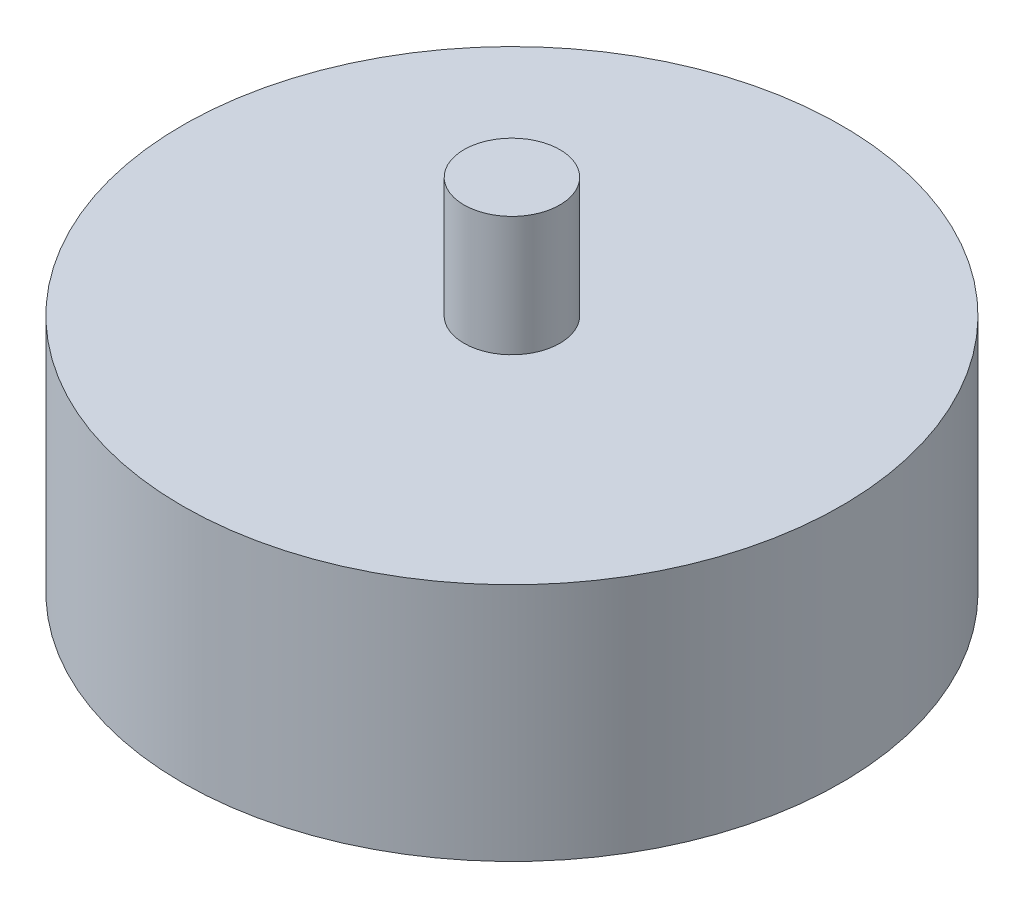
ISO-10303-21;
HEADER;
FILE_DESCRIPTION(('STEP AP214'),'2;1');
FILE_NAME('part.step','',(''),(''),'','','');
FILE_SCHEMA(('AUTOMOTIVE_DESIGN { 1 0 10303 214 1 1 1 1 }'));
ENDSEC;
DATA;
#1=APPLICATION_CONTEXT('core data for automotive mechanical design processes');
#2=APPLICATION_PROTOCOL_DEFINITION('international standard','automotive_design',2000,#1);
#3=PRODUCT_CONTEXT('',#1,'mechanical');
#4=PRODUCT('Part','Part','',(#3));
#5=PRODUCT_RELATED_PRODUCT_CATEGORY('part','',(#4));
#6=PRODUCT_DEFINITION_FORMATION('','',#4);
#7=PRODUCT_DEFINITION_CONTEXT('part definition',#1,'design');
#8=PRODUCT_DEFINITION('design','',#6,#7);
#9=PRODUCT_DEFINITION_SHAPE('','',#8);
#10=(LENGTH_UNIT() NAMED_UNIT(*) SI_UNIT(.MILLI.,.METRE.));
#11=(NAMED_UNIT(*) PLANE_ANGLE_UNIT() SI_UNIT($,.RADIAN.));
#12=(NAMED_UNIT(*) SI_UNIT($,.STERADIAN.) SOLID_ANGLE_UNIT());
#13=UNCERTAINTY_MEASURE_WITH_UNIT(LENGTH_MEASURE(1.E-05),#10,'distance_accuracy_value','');
#14=(GEOMETRIC_REPRESENTATION_CONTEXT(3) GLOBAL_UNCERTAINTY_ASSIGNED_CONTEXT((#13)) GLOBAL_UNIT_ASSIGNED_CONTEXT((#10,
#11,#12)) REPRESENTATION_CONTEXT('',''));
#15=CARTESIAN_POINT('',(0.,0.,0.));
#16=DIRECTION('',(0.,0.,1.));
#17=DIRECTION('',(1.,0.,0.));
#18=AXIS2_PLACEMENT_3D('',#15,#16,#17);
#19=CARTESIAN_POINT('',(0.,20.,0.));
#20=DIRECTION('',(0.,-1.,0.));
#21=DIRECTION('',(0.,0.,-1.));
#22=AXIS2_PLACEMENT_3D('',#19,#20,#21);
#23=CYLINDRICAL_SURFACE('',#22,27.5);
#24=CARTESIAN_POINT('',(0.,20.,0.));
#25=DIRECTION('',(0.,1.,0.));
#26=DIRECTION('',(0.,0.,1.));
#27=AXIS2_PLACEMENT_3D('',#24,#25,#26);
#28=CIRCLE('',#27,27.5);
#29=CARTESIAN_POINT('',(0.,20.,27.5));
#30=VERTEX_POINT('',#29);
#31=EDGE_CURVE('E10',#30,#30,#28,.T.);
#32=ORIENTED_EDGE('',*,*,#31,.F.);
#33=EDGE_LOOP('',(#32));
#34=FACE_BOUND('',#33,.T.);
#35=CARTESIAN_POINT('',(0.,0.,0.));
#36=DIRECTION('',(0.,1.,0.));
#37=DIRECTION('',(0.,0.,1.));
#38=AXIS2_PLACEMENT_3D('',#35,#36,#37);
#39=CIRCLE('',#38,27.5);
#40=CARTESIAN_POINT('',(0.,0.,27.5));
#41=VERTEX_POINT('',#40);
#42=EDGE_CURVE('E40',#41,#41,#39,.T.);
#43=ORIENTED_EDGE('',*,*,#42,.T.);
#44=EDGE_LOOP('',(#43));
#45=FACE_BOUND('',#44,.T.);
#46=ADVANCED_FACE('F37',(#34,#45),#23,.T.);
#47=CARTESIAN_POINT('',(0.,20.,0.));
#48=DIRECTION('',(0.,1.,0.));
#49=DIRECTION('',(0.,0.,1.));
#50=AXIS2_PLACEMENT_3D('',#47,#48,#49);
#51=PLANE('',#50);
#52=CARTESIAN_POINT('',(0.,20.,0.));
#53=DIRECTION('',(0.,1.,0.));
#54=DIRECTION('',(0.,0.,1.));
#55=AXIS2_PLACEMENT_3D('',#52,#53,#54);
#56=CIRCLE('',#55,4.);
#57=CARTESIAN_POINT('',(0.,20.,4.));
#58=VERTEX_POINT('',#57);
#59=EDGE_CURVE('E49',#58,#58,#56,.T.);
#60=ORIENTED_EDGE('',*,*,#59,.F.);
#61=EDGE_LOOP('',(#60));
#62=FACE_BOUND('',#61,.T.);
#63=ORIENTED_EDGE('',*,*,#31,.T.);
#64=EDGE_LOOP('',(#63));
#65=FACE_BOUND('',#64,.T.);
#66=ADVANCED_FACE('F64',(#62,#65),#51,.T.);
#67=CARTESIAN_POINT('',(0.,0.,0.));
#68=DIRECTION('',(0.,1.,0.));
#69=DIRECTION('',(0.,0.,1.));
#70=AXIS2_PLACEMENT_3D('',#67,#68,#69);
#71=PLANE('',#70);
#72=ORIENTED_EDGE('',*,*,#42,.F.);
#73=EDGE_LOOP('',(#72));
#74=FACE_BOUND('',#73,.T.);
#75=ADVANCED_FACE('F60',(#74),#71,.F.);
#76=CARTESIAN_POINT('',(0.,30.,0.));
#77=DIRECTION('',(0.,-1.,0.));
#78=DIRECTION('',(0.,0.,-1.));
#79=AXIS2_PLACEMENT_3D('',#76,#77,#78);
#80=CYLINDRICAL_SURFACE('',#79,4.);
#81=CARTESIAN_POINT('',(0.,30.,0.));
#82=DIRECTION('',(0.,1.,0.));
#83=DIRECTION('',(0.,0.,1.));
#84=AXIS2_PLACEMENT_3D('',#81,#82,#83);
#85=CIRCLE('',#84,4.);
#86=CARTESIAN_POINT('',(0.,30.,4.));
#87=VERTEX_POINT('',#86);
#88=EDGE_CURVE('E47',#87,#87,#85,.T.);
#89=ORIENTED_EDGE('',*,*,#88,.F.);
#90=EDGE_LOOP('',(#89));
#91=FACE_BOUND('',#90,.T.);
#92=ORIENTED_EDGE('',*,*,#59,.T.);
#93=EDGE_LOOP('',(#92));
#94=FACE_BOUND('',#93,.T.);
#95=ADVANCED_FACE('F57',(#91,#94),#80,.T.);
#96=CARTESIAN_POINT('',(0.,30.,0.));
#97=DIRECTION('',(0.,1.,0.));
#98=DIRECTION('',(0.,0.,1.));
#99=AXIS2_PLACEMENT_3D('',#96,#97,#98);
#100=PLANE('',#99);
#101=ORIENTED_EDGE('',*,*,#88,.T.);
#102=EDGE_LOOP('',(#101));
#103=FACE_BOUND('',#102,.T.);
#104=ADVANCED_FACE('F55',(#103),#100,.T.);
#105=CLOSED_SHELL('',(#46,#66,#75,#95,#104));
#106=MANIFOLD_SOLID_BREP('B2',#105);
#107=ADVANCED_BREP_SHAPE_REPRESENTATION('',(#18,#106),#14);
#108=SHAPE_DEFINITION_REPRESENTATION(#9,#107);
ENDSEC;
END-ISO-10303-21;
